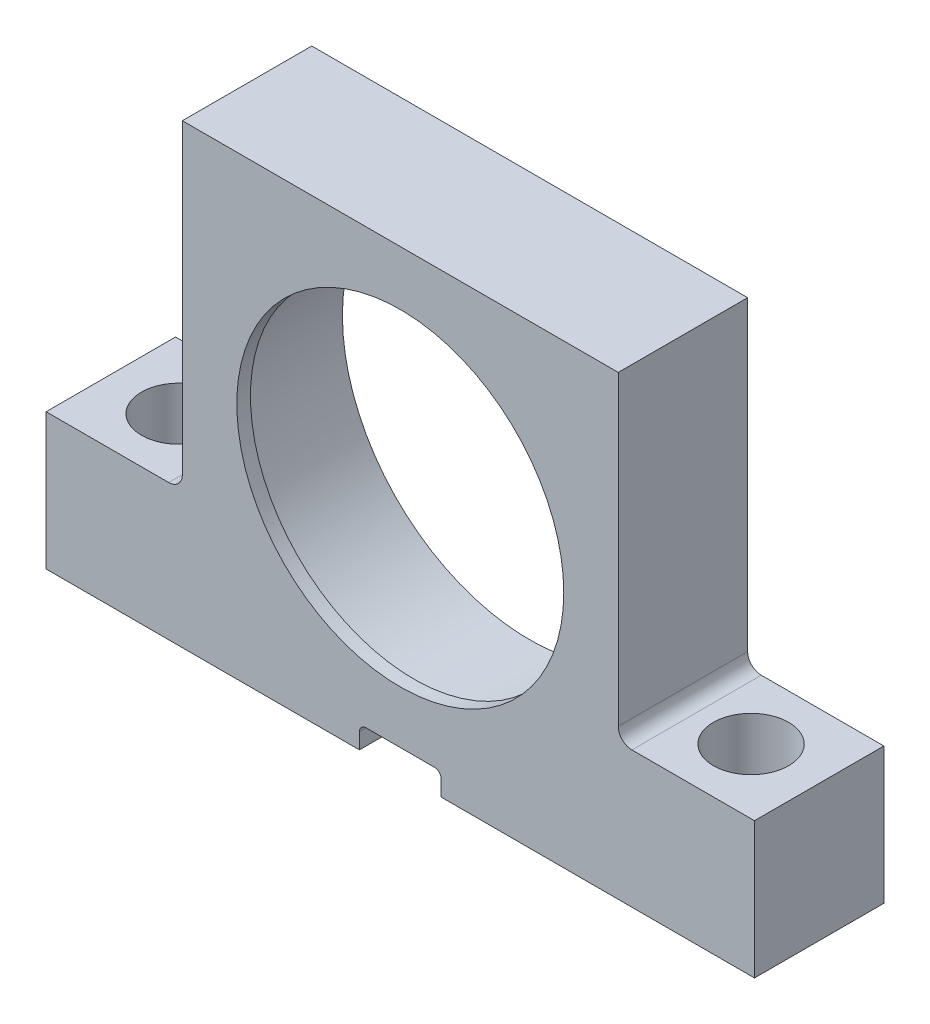
ISO-10303-21;
HEADER;
FILE_DESCRIPTION(('STEP AP214'),'2;1');
FILE_NAME('part.step','',(''),(''),'','','');
FILE_SCHEMA(('AUTOMOTIVE_DESIGN { 1 0 10303 214 1 1 1 1 }'));
ENDSEC;
DATA;
#1=APPLICATION_CONTEXT('core data for automotive mechanical design processes');
#2=APPLICATION_PROTOCOL_DEFINITION('international standard','automotive_design',2000,#1);
#3=PRODUCT_CONTEXT('',#1,'mechanical');
#4=PRODUCT('Part','Part','',(#3));
#5=PRODUCT_RELATED_PRODUCT_CATEGORY('part','',(#4));
#6=PRODUCT_DEFINITION_FORMATION('','',#4);
#7=PRODUCT_DEFINITION_CONTEXT('part definition',#1,'design');
#8=PRODUCT_DEFINITION('design','',#6,#7);
#9=PRODUCT_DEFINITION_SHAPE('','',#8);
#10=(LENGTH_UNIT() NAMED_UNIT(*) SI_UNIT(.MILLI.,.METRE.));
#11=(NAMED_UNIT(*) PLANE_ANGLE_UNIT() SI_UNIT($,.RADIAN.));
#12=(NAMED_UNIT(*) SI_UNIT($,.STERADIAN.) SOLID_ANGLE_UNIT());
#13=UNCERTAINTY_MEASURE_WITH_UNIT(LENGTH_MEASURE(1.E-05),#10,'distance_accuracy_value','');
#14=(GEOMETRIC_REPRESENTATION_CONTEXT(3) GLOBAL_UNCERTAINTY_ASSIGNED_CONTEXT((#13)) GLOBAL_UNIT_ASSIGNED_CONTEXT((#10,
#11,#12)) REPRESENTATION_CONTEXT('',''));
#15=CARTESIAN_POINT('',(0.,0.,0.));
#16=DIRECTION('',(0.,0.,1.));
#17=DIRECTION('',(1.,0.,0.));
#18=AXIS2_PLACEMENT_3D('',#15,#16,#17);
#19=CARTESIAN_POINT('',(-52.,-10.,19.));
#20=DIRECTION('',(0.,1.,0.));
#21=DIRECTION('',(0.,0.,1.));
#22=AXIS2_PLACEMENT_3D('',#19,#20,#21);
#23=PLANE('',#22);
#24=CARTESIAN_POINT('',(-42.,-10.,9.5));
#25=DIRECTION('',(0.,1.,0.));
#26=DIRECTION('',(0.,0.,1.));
#27=AXIS2_PLACEMENT_3D('',#24,#25,#26);
#28=CIRCLE('',#27,5.5);
#29=CARTESIAN_POINT('',(-42.,-10.,15.));
#30=VERTEX_POINT('',#29);
#31=EDGE_CURVE('E221',#30,#30,#28,.T.);
#32=ORIENTED_EDGE('',*,*,#31,.T.);
#33=EDGE_LOOP('',(#32));
#34=FACE_BOUND('',#33,.T.);
#35=DIRECTION('',(1.,0.,0.));
#36=VECTOR('',#35,1.);
#37=CARTESIAN_POINT('',(-52.,-10.,0.));
#38=LINE('',#37,#36);
#39=CARTESIAN_POINT('',(-52.,-10.,0.));
#40=VERTEX_POINT('',#39);
#41=CARTESIAN_POINT('',(-6.,-10.,0.));
#42=VERTEX_POINT('',#41);
#43=EDGE_CURVE('E181',#40,#42,#38,.T.);
#44=ORIENTED_EDGE('',*,*,#43,.T.);
#45=DIRECTION('',(0.,0.,1.));
#46=VECTOR('',#45,1.);
#47=CARTESIAN_POINT('',(-6.,-10.,19.));
#48=LINE('',#47,#46);
#49=CARTESIAN_POINT('',(-6.,-10.,19.));
#50=VERTEX_POINT('',#49);
#51=EDGE_CURVE('E340',#42,#50,#48,.T.);
#52=ORIENTED_EDGE('',*,*,#51,.T.);
#53=DIRECTION('',(1.,0.,0.));
#54=VECTOR('',#53,1.);
#55=CARTESIAN_POINT('',(-52.,-10.,19.));
#56=LINE('',#55,#54);
#57=CARTESIAN_POINT('',(-52.,-10.,19.));
#58=VERTEX_POINT('',#57);
#59=EDGE_CURVE('E196',#58,#50,#56,.T.);
#60=ORIENTED_EDGE('',*,*,#59,.F.);
#61=DIRECTION('',(0.,0.,-1.));
#62=VECTOR('',#61,1.);
#63=CARTESIAN_POINT('',(-52.,-10.,19.));
#64=LINE('',#63,#62);
#65=EDGE_CURVE('E195',#58,#40,#64,.T.);
#66=ORIENTED_EDGE('',*,*,#65,.T.);
#67=EDGE_LOOP('',(#44,#52,#60,#66));
#68=FACE_BOUND('',#67,.T.);
#69=ADVANCED_FACE('F39',(#34,#68),#23,.F.);
#70=CARTESIAN_POINT('',(0.,25.,0.));
#71=DIRECTION('',(0.,0.,1.));
#72=DIRECTION('',(1.,0.,0.));
#73=AXIS2_PLACEMENT_3D('',#70,#71,#72);
#74=CYLINDRICAL_SURFACE('',#73,27.5);
#75=CARTESIAN_POINT('',(0.,25.,0.));
#76=DIRECTION('',(0.,0.,1.));
#77=DIRECTION('',(1.,0.,0.));
#78=AXIS2_PLACEMENT_3D('',#75,#76,#77);
#79=CIRCLE('',#78,27.5);
#80=CARTESIAN_POINT('',(27.5,25.,0.));
#81=VERTEX_POINT('',#80);
#82=EDGE_CURVE('E226',#81,#81,#79,.T.);
#83=ORIENTED_EDGE('',*,*,#82,.F.);
#84=EDGE_LOOP('',(#83));
#85=FACE_BOUND('',#84,.T.);
#86=CARTESIAN_POINT('',(0.,25.,17.));
#87=DIRECTION('',(0.,0.,1.));
#88=DIRECTION('',(1.,0.,0.));
#89=AXIS2_PLACEMENT_3D('',#86,#87,#88);
#90=CIRCLE('',#89,27.5);
#91=CARTESIAN_POINT('',(27.5,25.,17.));
#92=VERTEX_POINT('',#91);
#93=EDGE_CURVE('E216',#92,#92,#90,.F.);
#94=ORIENTED_EDGE('',*,*,#93,.F.);
#95=EDGE_LOOP('',(#94));
#96=FACE_BOUND('',#95,.T.);
#97=ADVANCED_FACE('F369',(#85,#96),#74,.F.);
#98=CARTESIAN_POINT('',(52.,10.,19.));
#99=DIRECTION('',(-1.,0.,0.));
#100=DIRECTION('',(0.,0.,1.));
#101=AXIS2_PLACEMENT_3D('',#98,#99,#100);
#102=PLANE('',#101);
#103=DIRECTION('',(0.,1.,0.));
#104=VECTOR('',#103,1.);
#105=CARTESIAN_POINT('',(52.,10.,0.));
#106=LINE('',#105,#104);
#107=CARTESIAN_POINT('',(52.,-10.,0.));
#108=VERTEX_POINT('',#107);
#109=CARTESIAN_POINT('',(52.,10.,0.));
#110=VERTEX_POINT('',#109);
#111=EDGE_CURVE('E179',#108,#110,#106,.T.);
#112=ORIENTED_EDGE('',*,*,#111,.T.);
#113=DIRECTION('',(0.,0.,-1.));
#114=VECTOR('',#113,1.);
#115=CARTESIAN_POINT('',(52.,10.,19.));
#116=LINE('',#115,#114);
#117=CARTESIAN_POINT('',(52.,10.,19.));
#118=VERTEX_POINT('',#117);
#119=EDGE_CURVE('E212',#118,#110,#116,.T.);
#120=ORIENTED_EDGE('',*,*,#119,.F.);
#121=DIRECTION('',(0.,1.,0.));
#122=VECTOR('',#121,1.);
#123=CARTESIAN_POINT('',(52.,10.,19.));
#124=LINE('',#123,#122);
#125=CARTESIAN_POINT('',(52.,-10.,19.));
#126=VERTEX_POINT('',#125);
#127=EDGE_CURVE('E187',#126,#118,#124,.T.);
#128=ORIENTED_EDGE('',*,*,#127,.F.);
#129=DIRECTION('',(0.,0.,-1.));
#130=VECTOR('',#129,1.);
#131=CARTESIAN_POINT('',(52.,-10.,19.));
#132=LINE('',#131,#130);
#133=EDGE_CURVE('E192',#126,#108,#132,.T.);
#134=ORIENTED_EDGE('',*,*,#133,.T.);
#135=EDGE_LOOP('',(#112,#120,#128,#134));
#136=FACE_BOUND('',#135,.T.);
#137=ADVANCED_FACE('F367',(#136),#102,.F.);
#138=CARTESIAN_POINT('',(32.,10.,19.));
#139=DIRECTION('',(0.,-1.,0.));
#140=DIRECTION('',(0.,0.,-1.));
#141=AXIS2_PLACEMENT_3D('',#138,#139,#140);
#142=PLANE('',#141);
#143=CARTESIAN_POINT('',(42.,10.,9.5));
#144=DIRECTION('',(0.,1.,0.));
#145=DIRECTION('',(0.,0.,1.));
#146=AXIS2_PLACEMENT_3D('',#143,#144,#145);
#147=CIRCLE('',#146,5.52326756388864);
#148=CARTESIAN_POINT('',(42.,10.,15.0232675638886));
#149=VERTEX_POINT('',#148);
#150=EDGE_CURVE('E573',#149,#149,#147,.T.);
#151=ORIENTED_EDGE('',*,*,#150,.F.);
#152=EDGE_LOOP('',(#151));
#153=FACE_BOUND('',#152,.T.);
#154=DIRECTION('',(-1.,0.,0.));
#155=VECTOR('',#154,1.);
#156=CARTESIAN_POINT('',(32.,10.,0.));
#157=LINE('',#156,#155);
#158=CARTESIAN_POINT('',(34.,10.,0.));
#159=VERTEX_POINT('',#158);
#160=EDGE_CURVE('E310',#110,#159,#157,.T.);
#161=ORIENTED_EDGE('',*,*,#160,.T.);
#162=DIRECTION('',(0.,0.,-1.));
#163=VECTOR('',#162,1.);
#164=CARTESIAN_POINT('',(34.,10.,19.));
#165=LINE('',#164,#163);
#166=CARTESIAN_POINT('',(34.,10.,19.));
#167=VERTEX_POINT('',#166);
#168=EDGE_CURVE('E55',#159,#167,#165,.F.);
#169=ORIENTED_EDGE('',*,*,#168,.T.);
#170=DIRECTION('',(-1.,0.,0.));
#171=VECTOR('',#170,1.);
#172=CARTESIAN_POINT('',(32.,10.,19.));
#173=LINE('',#172,#171);
#174=EDGE_CURVE('E296',#118,#167,#173,.T.);
#175=ORIENTED_EDGE('',*,*,#174,.F.);
#176=ORIENTED_EDGE('',*,*,#119,.T.);
#177=EDGE_LOOP('',(#161,#169,#175,#176));
#178=FACE_BOUND('',#177,.T.);
#179=ADVANCED_FACE('F365',(#153,#178),#142,.F.);
#180=CARTESIAN_POINT('',(32.,10.,19.));
#181=DIRECTION('',(-1.,0.,0.));
#182=DIRECTION('',(0.,0.,1.));
#183=AXIS2_PLACEMENT_3D('',#180,#181,#182);
#184=PLANE('',#183);
#185=DIRECTION('',(0.,1.,0.));
#186=VECTOR('',#185,1.);
#187=CARTESIAN_POINT('',(32.,10.,19.));
#188=LINE('',#187,#186);
#189=CARTESIAN_POINT('',(32.,12.,19.));
#190=VERTEX_POINT('',#189);
#191=CARTESIAN_POINT('',(32.,57.,19.));
#192=VERTEX_POINT('',#191);
#193=EDGE_CURVE('E293',#190,#192,#188,.T.);
#194=ORIENTED_EDGE('',*,*,#193,.F.);
#195=DIRECTION('',(0.,0.,-1.));
#196=VECTOR('',#195,1.);
#197=CARTESIAN_POINT('',(32.,12.,0.));
#198=LINE('',#197,#196);
#199=CARTESIAN_POINT('',(32.,12.,0.));
#200=VERTEX_POINT('',#199);
#201=EDGE_CURVE('E264',#190,#200,#198,.T.);
#202=ORIENTED_EDGE('',*,*,#201,.T.);
#203=DIRECTION('',(0.,1.,0.));
#204=VECTOR('',#203,1.);
#205=CARTESIAN_POINT('',(32.,10.,0.));
#206=LINE('',#205,#204);
#207=CARTESIAN_POINT('',(32.,57.,0.));
#208=VERTEX_POINT('',#207);
#209=EDGE_CURVE('E313',#200,#208,#206,.T.);
#210=ORIENTED_EDGE('',*,*,#209,.T.);
#211=DIRECTION('',(0.,0.,-1.));
#212=VECTOR('',#211,1.);
#213=CARTESIAN_POINT('',(32.,57.,19.));
#214=LINE('',#213,#212);
#215=EDGE_CURVE('E208',#192,#208,#214,.T.);
#216=ORIENTED_EDGE('',*,*,#215,.F.);
#217=EDGE_LOOP('',(#194,#202,#210,#216));
#218=FACE_BOUND('',#217,.T.);
#219=ADVANCED_FACE('F361',(#218),#184,.F.);
#220=CARTESIAN_POINT('',(-32.,57.,19.));
#221=DIRECTION('',(0.,-1.,0.));
#222=DIRECTION('',(0.,0.,-1.));
#223=AXIS2_PLACEMENT_3D('',#220,#221,#222);
#224=PLANE('',#223);
#225=DIRECTION('',(-1.,0.,0.));
#226=VECTOR('',#225,1.);
#227=CARTESIAN_POINT('',(-32.,57.,0.));
#228=LINE('',#227,#226);
#229=CARTESIAN_POINT('',(-32.,57.,0.));
#230=VERTEX_POINT('',#229);
#231=EDGE_CURVE('E316',#208,#230,#228,.T.);
#232=ORIENTED_EDGE('',*,*,#231,.T.);
#233=DIRECTION('',(0.,0.,-1.));
#234=VECTOR('',#233,1.);
#235=CARTESIAN_POINT('',(-32.,57.,19.));
#236=LINE('',#235,#234);
#237=CARTESIAN_POINT('',(-32.,57.,19.));
#238=VERTEX_POINT('',#237);
#239=EDGE_CURVE('E204',#238,#230,#236,.T.);
#240=ORIENTED_EDGE('',*,*,#239,.F.);
#241=DIRECTION('',(-1.,0.,0.));
#242=VECTOR('',#241,1.);
#243=CARTESIAN_POINT('',(-32.,57.,19.));
#244=LINE('',#243,#242);
#245=EDGE_CURVE('E290',#192,#238,#244,.T.);
#246=ORIENTED_EDGE('',*,*,#245,.F.);
#247=ORIENTED_EDGE('',*,*,#215,.T.);
#248=EDGE_LOOP('',(#232,#240,#246,#247));
#249=FACE_BOUND('',#248,.T.);
#250=ADVANCED_FACE('F357',(#249),#224,.F.);
#251=CARTESIAN_POINT('',(-32.,10.,19.));
#252=DIRECTION('',(1.,0.,0.));
#253=DIRECTION('',(0.,0.,-1.));
#254=AXIS2_PLACEMENT_3D('',#251,#252,#253);
#255=PLANE('',#254);
#256=DIRECTION('',(0.,-1.,0.));
#257=VECTOR('',#256,1.);
#258=CARTESIAN_POINT('',(-32.,10.,0.));
#259=LINE('',#258,#257);
#260=CARTESIAN_POINT('',(-32.,12.,0.));
#261=VERTEX_POINT('',#260);
#262=EDGE_CURVE('E319',#230,#261,#259,.T.);
#263=ORIENTED_EDGE('',*,*,#262,.T.);
#264=DIRECTION('',(0.,0.,-1.));
#265=VECTOR('',#264,1.);
#266=CARTESIAN_POINT('',(-32.,12.,19.));
#267=LINE('',#266,#265);
#268=CARTESIAN_POINT('',(-32.,12.,19.));
#269=VERTEX_POINT('',#268);
#270=EDGE_CURVE('E261',#261,#269,#267,.F.);
#271=ORIENTED_EDGE('',*,*,#270,.T.);
#272=DIRECTION('',(0.,-1.,0.));
#273=VECTOR('',#272,1.);
#274=CARTESIAN_POINT('',(-32.,10.,19.));
#275=LINE('',#274,#273);
#276=EDGE_CURVE('E286',#238,#269,#275,.T.);
#277=ORIENTED_EDGE('',*,*,#276,.F.);
#278=ORIENTED_EDGE('',*,*,#239,.T.);
#279=EDGE_LOOP('',(#263,#271,#277,#278));
#280=FACE_BOUND('',#279,.T.);
#281=ADVANCED_FACE('F352',(#280),#255,.F.);
#282=CARTESIAN_POINT('',(-52.,10.,19.));
#283=DIRECTION('',(0.,-1.,0.));
#284=DIRECTION('',(0.,0.,-1.));
#285=AXIS2_PLACEMENT_3D('',#282,#283,#284);
#286=PLANE('',#285);
#287=CARTESIAN_POINT('',(-42.,10.,9.5));
#288=DIRECTION('',(0.,1.,0.));
#289=DIRECTION('',(0.,0.,1.));
#290=AXIS2_PLACEMENT_3D('',#287,#288,#289);
#291=CIRCLE('',#290,5.5);
#292=CARTESIAN_POINT('',(-42.,10.,15.));
#293=VERTEX_POINT('',#292);
#294=EDGE_CURVE('E222',#293,#293,#291,.T.);
#295=ORIENTED_EDGE('',*,*,#294,.F.);
#296=EDGE_LOOP('',(#295));
#297=FACE_BOUND('',#296,.T.);
#298=DIRECTION('',(-1.,0.,0.));
#299=VECTOR('',#298,1.);
#300=CARTESIAN_POINT('',(-52.,10.,19.));
#301=LINE('',#300,#299);
#302=CARTESIAN_POINT('',(-34.,10.,19.));
#303=VERTEX_POINT('',#302);
#304=CARTESIAN_POINT('',(-52.,10.,19.));
#305=VERTEX_POINT('',#304);
#306=EDGE_CURVE('E283',#303,#305,#301,.T.);
#307=ORIENTED_EDGE('',*,*,#306,.F.);
#308=DIRECTION('',(0.,0.,-1.));
#309=VECTOR('',#308,1.);
#310=CARTESIAN_POINT('',(-34.,10.,0.));
#311=LINE('',#310,#309);
#312=CARTESIAN_POINT('',(-34.,10.,0.));
#313=VERTEX_POINT('',#312);
#314=EDGE_CURVE('E257',#303,#313,#311,.T.);
#315=ORIENTED_EDGE('',*,*,#314,.T.);
#316=DIRECTION('',(-1.,0.,0.));
#317=VECTOR('',#316,1.);
#318=CARTESIAN_POINT('',(-52.,10.,0.));
#319=LINE('',#318,#317);
#320=CARTESIAN_POINT('',(-52.,10.,0.));
#321=VERTEX_POINT('',#320);
#322=EDGE_CURVE('E188',#313,#321,#319,.T.);
#323=ORIENTED_EDGE('',*,*,#322,.T.);
#324=DIRECTION('',(0.,0.,-1.));
#325=VECTOR('',#324,1.);
#326=CARTESIAN_POINT('',(-52.,10.,19.));
#327=LINE('',#326,#325);
#328=EDGE_CURVE('E200',#305,#321,#327,.T.);
#329=ORIENTED_EDGE('',*,*,#328,.F.);
#330=EDGE_LOOP('',(#307,#315,#323,#329));
#331=FACE_BOUND('',#330,.T.);
#332=ADVANCED_FACE('F327',(#297,#331),#286,.F.);
#333=CARTESIAN_POINT('',(-52.,10.,19.));
#334=DIRECTION('',(1.,0.,0.));
#335=DIRECTION('',(0.,0.,-1.));
#336=AXIS2_PLACEMENT_3D('',#333,#334,#335);
#337=PLANE('',#336);
#338=DIRECTION('',(0.,-1.,0.));
#339=VECTOR('',#338,1.);
#340=CARTESIAN_POINT('',(-52.,10.,0.));
#341=LINE('',#340,#339);
#342=EDGE_CURVE('E182',#321,#40,#341,.T.);
#343=ORIENTED_EDGE('',*,*,#342,.T.);
#344=ORIENTED_EDGE('',*,*,#65,.F.);
#345=DIRECTION('',(0.,-1.,0.));
#346=VECTOR('',#345,1.);
#347=CARTESIAN_POINT('',(-52.,10.,19.));
#348=LINE('',#347,#346);
#349=EDGE_CURVE('E281',#305,#58,#348,.T.);
#350=ORIENTED_EDGE('',*,*,#349,.F.);
#351=ORIENTED_EDGE('',*,*,#328,.T.);
#352=EDGE_LOOP('',(#343,#344,#350,#351));
#353=FACE_BOUND('',#352,.T.);
#354=ADVANCED_FACE('F332',(#353),#337,.F.);
#355=CARTESIAN_POINT('',(42.,-10.,9.5));
#356=DIRECTION('',(0.,1.,0.));
#357=DIRECTION('',(0.,0.,1.));
#358=AXIS2_PLACEMENT_3D('',#355,#356,#357);
#359=CIRCLE('',#358,5.52326756388864);
#360=CARTESIAN_POINT('',(42.,-10.,15.0232675638886));
#361=VERTEX_POINT('',#360);
#362=EDGE_CURVE('E217',#361,#361,#359,.T.);
#363=ORIENTED_EDGE('',*,*,#362,.T.);
#364=EDGE_LOOP('',(#363));
#365=FACE_BOUND('',#364,.T.);
#366=CARTESIAN_POINT('',(6.,-10.,19.));
#367=VERTEX_POINT('',#366);
#368=EDGE_CURVE('E170',#367,#126,#56,.T.);
#369=ORIENTED_EDGE('',*,*,#368,.F.);
#370=DIRECTION('',(0.,0.,-1.));
#371=VECTOR('',#370,1.);
#372=CARTESIAN_POINT('',(6.,-10.,19.));
#373=LINE('',#372,#371);
#374=CARTESIAN_POINT('',(6.,-10.,0.));
#375=VERTEX_POINT('',#374);
#376=EDGE_CURVE('E155',#367,#375,#373,.T.);
#377=ORIENTED_EDGE('',*,*,#376,.T.);
#378=EDGE_CURVE('E168',#375,#108,#38,.T.);
#379=ORIENTED_EDGE('',*,*,#378,.T.);
#380=ORIENTED_EDGE('',*,*,#133,.F.);
#381=EDGE_LOOP('',(#369,#377,#379,#380));
#382=FACE_BOUND('',#381,.T.);
#383=ADVANCED_FACE('F166',(#365,#382),#23,.F.);
#384=CARTESIAN_POINT('',(0.,0.,19.));
#385=DIRECTION('',(0.,0.,1.));
#386=DIRECTION('',(1.,0.,0.));
#387=AXIS2_PLACEMENT_3D('',#384,#385,#386);
#388=PLANE('',#387);
#389=DIRECTION('',(0.,-1.,0.));
#390=VECTOR('',#389,1.);
#391=CARTESIAN_POINT('',(-6.,0.,19.));
#392=LINE('',#391,#390);
#393=CARTESIAN_POINT('',(-6.,-7.70000000000001,19.));
#394=VERTEX_POINT('',#393);
#395=EDGE_CURVE('E172',#394,#50,#392,.T.);
#396=ORIENTED_EDGE('',*,*,#395,.F.);
#397=CARTESIAN_POINT('',(-5.,-7.70000000000001,19.));
#398=DIRECTION('',(0.,0.,1.));
#399=DIRECTION('',(1.,0.,0.));
#400=AXIS2_PLACEMENT_3D('',#397,#398,#399);
#401=CIRCLE('',#400,1.);
#402=CARTESIAN_POINT('',(-5.,-6.70000000000001,19.));
#403=VERTEX_POINT('',#402);
#404=EDGE_CURVE('E254',#394,#403,#401,.F.);
#405=ORIENTED_EDGE('',*,*,#404,.T.);
#406=DIRECTION('',(-1.,0.,0.));
#407=VECTOR('',#406,1.);
#408=CARTESIAN_POINT('',(0.,-6.70000000000001,19.));
#409=LINE('',#408,#407);
#410=CARTESIAN_POINT('',(5.,-6.70000000000001,19.));
#411=VERTEX_POINT('',#410);
#412=EDGE_CURVE('E161',#411,#403,#409,.T.);
#413=ORIENTED_EDGE('',*,*,#412,.F.);
#414=CARTESIAN_POINT('',(5.,-7.70000000000001,19.));
#415=DIRECTION('',(0.,0.,1.));
#416=DIRECTION('',(1.,0.,0.));
#417=AXIS2_PLACEMENT_3D('',#414,#415,#416);
#418=CIRCLE('',#417,1.);
#419=CARTESIAN_POINT('',(6.,-7.70000000000001,19.));
#420=VERTEX_POINT('',#419);
#421=EDGE_CURVE('E248',#411,#420,#418,.F.);
#422=ORIENTED_EDGE('',*,*,#421,.T.);
#423=DIRECTION('',(0.,1.,0.));
#424=VECTOR('',#423,1.);
#425=CARTESIAN_POINT('',(6.,0.,19.));
#426=LINE('',#425,#424);
#427=EDGE_CURVE('E173',#367,#420,#426,.T.);
#428=ORIENTED_EDGE('',*,*,#427,.F.);
#429=ORIENTED_EDGE('',*,*,#368,.T.);
#430=ORIENTED_EDGE('',*,*,#127,.T.);
#431=ORIENTED_EDGE('',*,*,#174,.T.);
#432=CARTESIAN_POINT('',(34.,12.,19.));
#433=DIRECTION('',(0.,0.,1.));
#434=DIRECTION('',(1.,0.,0.));
#435=AXIS2_PLACEMENT_3D('',#432,#433,#434);
#436=CIRCLE('',#435,2.);
#437=EDGE_CURVE('E11',#167,#190,#436,.F.);
#438=ORIENTED_EDGE('',*,*,#437,.T.);
#439=ORIENTED_EDGE('',*,*,#193,.T.);
#440=ORIENTED_EDGE('',*,*,#245,.T.);
#441=ORIENTED_EDGE('',*,*,#276,.T.);
#442=CARTESIAN_POINT('',(-34.,12.,19.));
#443=DIRECTION('',(0.,0.,1.));
#444=DIRECTION('',(1.,0.,0.));
#445=AXIS2_PLACEMENT_3D('',#442,#443,#444);
#446=CIRCLE('',#445,2.);
#447=EDGE_CURVE('E273',#269,#303,#446,.F.);
#448=ORIENTED_EDGE('',*,*,#447,.T.);
#449=ORIENTED_EDGE('',*,*,#306,.T.);
#450=ORIENTED_EDGE('',*,*,#349,.T.);
#451=ORIENTED_EDGE('',*,*,#59,.T.);
#452=EDGE_LOOP('',(#396,#405,#413,#422,#428,#429,#430,#431,#438,#439,#440,#441,#448,#449,#450,#451));
#453=FACE_BOUND('',#452,.T.);
#454=CARTESIAN_POINT('',(0.,25.,19.));
#455=DIRECTION('',(0.,0.,1.));
#456=DIRECTION('',(1.,0.,0.));
#457=AXIS2_PLACEMENT_3D('',#454,#455,#456);
#458=CIRCLE('',#457,24.);
#459=CARTESIAN_POINT('',(24.,25.,19.));
#460=VERTEX_POINT('',#459);
#461=EDGE_CURVE('E578',#460,#460,#458,.T.);
#462=ORIENTED_EDGE('',*,*,#461,.F.);
#463=EDGE_LOOP('',(#462));
#464=FACE_BOUND('',#463,.T.);
#465=ADVANCED_FACE('F342',(#453,#464),#388,.T.);
#466=CARTESIAN_POINT('',(0.,0.,0.));
#467=DIRECTION('',(0.,0.,1.));
#468=DIRECTION('',(1.,0.,0.));
#469=AXIS2_PLACEMENT_3D('',#466,#467,#468);
#470=PLANE('',#469);
#471=ORIENTED_EDGE('',*,*,#82,.T.);
#472=EDGE_LOOP('',(#471));
#473=FACE_BOUND('',#472,.T.);
#474=DIRECTION('',(1.,0.,0.));
#475=VECTOR('',#474,1.);
#476=CARTESIAN_POINT('',(6.,-6.70000000000001,0.));
#477=LINE('',#476,#475);
#478=CARTESIAN_POINT('',(-5.,-6.70000000000001,0.));
#479=VERTEX_POINT('',#478);
#480=CARTESIAN_POINT('',(5.,-6.70000000000001,0.));
#481=VERTEX_POINT('',#480);
#482=EDGE_CURVE('E162',#479,#481,#477,.T.);
#483=ORIENTED_EDGE('',*,*,#482,.F.);
#484=CARTESIAN_POINT('',(-5.,-7.70000000000001,0.));
#485=DIRECTION('',(0.,0.,1.));
#486=DIRECTION('',(1.,0.,0.));
#487=AXIS2_PLACEMENT_3D('',#484,#485,#486);
#488=CIRCLE('',#487,1.);
#489=CARTESIAN_POINT('',(-6.,-7.70000000000001,0.));
#490=VERTEX_POINT('',#489);
#491=EDGE_CURVE('E251',#479,#490,#488,.T.);
#492=ORIENTED_EDGE('',*,*,#491,.T.);
#493=DIRECTION('',(0.,-1.,0.));
#494=VECTOR('',#493,1.);
#495=CARTESIAN_POINT('',(-6.,0.,0.));
#496=LINE('',#495,#494);
#497=EDGE_CURVE('E230',#490,#42,#496,.T.);
#498=ORIENTED_EDGE('',*,*,#497,.T.);
#499=ORIENTED_EDGE('',*,*,#43,.F.);
#500=ORIENTED_EDGE('',*,*,#342,.F.);
#501=ORIENTED_EDGE('',*,*,#322,.F.);
#502=CARTESIAN_POINT('',(-34.,12.,0.));
#503=DIRECTION('',(0.,0.,1.));
#504=DIRECTION('',(1.,0.,0.));
#505=AXIS2_PLACEMENT_3D('',#502,#503,#504);
#506=CIRCLE('',#505,2.);
#507=EDGE_CURVE('E270',#313,#261,#506,.T.);
#508=ORIENTED_EDGE('',*,*,#507,.T.);
#509=ORIENTED_EDGE('',*,*,#262,.F.);
#510=ORIENTED_EDGE('',*,*,#231,.F.);
#511=ORIENTED_EDGE('',*,*,#209,.F.);
#512=CARTESIAN_POINT('',(34.,12.,0.));
#513=DIRECTION('',(0.,0.,1.));
#514=DIRECTION('',(1.,0.,0.));
#515=AXIS2_PLACEMENT_3D('',#512,#513,#514);
#516=CIRCLE('',#515,2.);
#517=EDGE_CURVE('E48',#200,#159,#516,.T.);
#518=ORIENTED_EDGE('',*,*,#517,.T.);
#519=ORIENTED_EDGE('',*,*,#160,.F.);
#520=ORIENTED_EDGE('',*,*,#111,.F.);
#521=ORIENTED_EDGE('',*,*,#378,.F.);
#522=DIRECTION('',(0.,-1.,0.));
#523=VECTOR('',#522,1.);
#524=CARTESIAN_POINT('',(6.,-6.70000000000001,0.));
#525=LINE('',#524,#523);
#526=CARTESIAN_POINT('',(6.,-7.70000000000001,0.));
#527=VERTEX_POINT('',#526);
#528=EDGE_CURVE('E151',#527,#375,#525,.T.);
#529=ORIENTED_EDGE('',*,*,#528,.F.);
#530=CARTESIAN_POINT('',(5.,-7.70000000000001,0.));
#531=DIRECTION('',(0.,0.,1.));
#532=DIRECTION('',(1.,0.,0.));
#533=AXIS2_PLACEMENT_3D('',#530,#531,#532);
#534=CIRCLE('',#533,1.);
#535=EDGE_CURVE('E245',#527,#481,#534,.T.);
#536=ORIENTED_EDGE('',*,*,#535,.T.);
#537=EDGE_LOOP('',(#483,#492,#498,#499,#500,#501,#508,#509,#510,#511,#518,#519,#520,#521,#529,#536));
#538=FACE_BOUND('',#537,.T.);
#539=ADVANCED_FACE('F177',(#473,#538),#470,.F.);
#540=CARTESIAN_POINT('',(42.,-20.,9.5));
#541=DIRECTION('',(0.,1.,0.));
#542=DIRECTION('',(0.,0.,1.));
#543=AXIS2_PLACEMENT_3D('',#540,#541,#542);
#544=CYLINDRICAL_SURFACE('',#543,5.52326756388864);
#545=ORIENTED_EDGE('',*,*,#150,.T.);
#546=EDGE_LOOP('',(#545));
#547=FACE_BOUND('',#546,.T.);
#548=ORIENTED_EDGE('',*,*,#362,.F.);
#549=EDGE_LOOP('',(#548));
#550=FACE_BOUND('',#549,.T.);
#551=ADVANCED_FACE('F396',(#547,#550),#544,.F.);
#552=CARTESIAN_POINT('',(-42.,-20.,9.5));
#553=DIRECTION('',(0.,1.,0.));
#554=DIRECTION('',(0.,0.,1.));
#555=AXIS2_PLACEMENT_3D('',#552,#553,#554);
#556=CYLINDRICAL_SURFACE('',#555,5.5);
#557=ORIENTED_EDGE('',*,*,#294,.T.);
#558=EDGE_LOOP('',(#557));
#559=FACE_BOUND('',#558,.T.);
#560=ORIENTED_EDGE('',*,*,#31,.F.);
#561=EDGE_LOOP('',(#560));
#562=FACE_BOUND('',#561,.T.);
#563=ADVANCED_FACE('F398',(#559,#562),#556,.F.);
#564=CARTESIAN_POINT('',(0.,25.,17.));
#565=DIRECTION('',(0.,0.,1.));
#566=DIRECTION('',(1.,0.,0.));
#567=AXIS2_PLACEMENT_3D('',#564,#565,#566);
#568=PLANE('',#567);
#569=CARTESIAN_POINT('',(0.,25.,17.));
#570=DIRECTION('',(0.,0.,1.));
#571=DIRECTION('',(1.,0.,0.));
#572=AXIS2_PLACEMENT_3D('',#569,#570,#571);
#573=CIRCLE('',#572,24.);
#574=CARTESIAN_POINT('',(24.,25.,17.));
#575=VERTEX_POINT('',#574);
#576=EDGE_CURVE('E576',#575,#575,#573,.T.);
#577=ORIENTED_EDGE('',*,*,#576,.T.);
#578=EDGE_LOOP('',(#577));
#579=FACE_BOUND('',#578,.T.);
#580=ORIENTED_EDGE('',*,*,#93,.T.);
#581=EDGE_LOOP('',(#580));
#582=FACE_BOUND('',#581,.T.);
#583=ADVANCED_FACE('F405',(#579,#582),#568,.F.);
#584=CARTESIAN_POINT('',(0.,25.,17.));
#585=DIRECTION('',(0.,0.,1.));
#586=DIRECTION('',(1.,0.,0.));
#587=AXIS2_PLACEMENT_3D('',#584,#585,#586);
#588=CYLINDRICAL_SURFACE('',#587,24.);
#589=ORIENTED_EDGE('',*,*,#576,.F.);
#590=EDGE_LOOP('',(#589));
#591=FACE_BOUND('',#590,.T.);
#592=ORIENTED_EDGE('',*,*,#461,.T.);
#593=EDGE_LOOP('',(#592));
#594=FACE_BOUND('',#593,.T.);
#595=ADVANCED_FACE('F413',(#591,#594),#588,.F.);
#596=CARTESIAN_POINT('',(-6.,-6.70000000000001,30.));
#597=DIRECTION('',(-1.,0.,0.));
#598=DIRECTION('',(0.,0.,1.));
#599=AXIS2_PLACEMENT_3D('',#596,#597,#598);
#600=PLANE('',#599);
#601=ORIENTED_EDGE('',*,*,#497,.F.);
#602=DIRECTION('',(0.,0.,-1.));
#603=VECTOR('',#602,1.);
#604=CARTESIAN_POINT('',(-6.,-7.70000000000001,19.));
#605=LINE('',#604,#603);
#606=EDGE_CURVE('E242',#490,#394,#605,.F.);
#607=ORIENTED_EDGE('',*,*,#606,.T.);
#608=ORIENTED_EDGE('',*,*,#395,.T.);
#609=ORIENTED_EDGE('',*,*,#51,.F.);
#610=EDGE_LOOP('',(#601,#607,#608,#609));
#611=FACE_BOUND('',#610,.T.);
#612=ADVANCED_FACE('F417',(#611),#600,.F.);
#613=CARTESIAN_POINT('',(6.,-6.70000000000001,30.));
#614=DIRECTION('',(1.,0.,0.));
#615=DIRECTION('',(0.,0.,-1.));
#616=AXIS2_PLACEMENT_3D('',#613,#614,#615);
#617=PLANE('',#616);
#618=ORIENTED_EDGE('',*,*,#427,.T.);
#619=DIRECTION('',(0.,0.,-1.));
#620=VECTOR('',#619,1.);
#621=CARTESIAN_POINT('',(6.,-7.70000000000001,0.));
#622=LINE('',#621,#620);
#623=EDGE_CURVE('E158',#420,#527,#622,.T.);
#624=ORIENTED_EDGE('',*,*,#623,.T.);
#625=ORIENTED_EDGE('',*,*,#528,.T.);
#626=ORIENTED_EDGE('',*,*,#376,.F.);
#627=EDGE_LOOP('',(#618,#624,#625,#626));
#628=FACE_BOUND('',#627,.T.);
#629=ADVANCED_FACE('F154',(#628),#617,.F.);
#630=CARTESIAN_POINT('',(6.,-6.70000000000001,30.));
#631=DIRECTION('',(0.,1.,0.));
#632=DIRECTION('',(0.,0.,1.));
#633=AXIS2_PLACEMENT_3D('',#630,#631,#632);
#634=PLANE('',#633);
#635=ORIENTED_EDGE('',*,*,#482,.T.);
#636=DIRECTION('',(0.,0.,-1.));
#637=VECTOR('',#636,1.);
#638=CARTESIAN_POINT('',(5.,-6.70000000000001,19.));
#639=LINE('',#638,#637);
#640=EDGE_CURVE('E239',#481,#411,#639,.F.);
#641=ORIENTED_EDGE('',*,*,#640,.T.);
#642=ORIENTED_EDGE('',*,*,#412,.T.);
#643=DIRECTION('',(0.,0.,-1.));
#644=VECTOR('',#643,1.);
#645=CARTESIAN_POINT('',(-5.,-6.70000000000001,0.));
#646=LINE('',#645,#644);
#647=EDGE_CURVE('E235',#403,#479,#646,.T.);
#648=ORIENTED_EDGE('',*,*,#647,.T.);
#649=EDGE_LOOP('',(#635,#641,#642,#648));
#650=FACE_BOUND('',#649,.T.);
#651=ADVANCED_FACE('F422',(#650),#634,.F.);
#652=CARTESIAN_POINT('',(5.,-7.70000000000001,30.));
#653=DIRECTION('',(0.,0.,1.));
#654=DIRECTION('',(1.,0.,0.));
#655=AXIS2_PLACEMENT_3D('',#652,#653,#654);
#656=CYLINDRICAL_SURFACE('',#655,1.);
#657=ORIENTED_EDGE('',*,*,#421,.F.);
#658=ORIENTED_EDGE('',*,*,#640,.F.);
#659=ORIENTED_EDGE('',*,*,#535,.F.);
#660=ORIENTED_EDGE('',*,*,#623,.F.);
#661=EDGE_LOOP('',(#657,#658,#659,#660));
#662=FACE_BOUND('',#661,.T.);
#663=ADVANCED_FACE('F425',(#662),#656,.F.);
#664=CARTESIAN_POINT('',(-5.,-7.70000000000001,30.));
#665=DIRECTION('',(0.,0.,1.));
#666=DIRECTION('',(1.,0.,0.));
#667=AXIS2_PLACEMENT_3D('',#664,#665,#666);
#668=CYLINDRICAL_SURFACE('',#667,1.);
#669=ORIENTED_EDGE('',*,*,#404,.F.);
#670=ORIENTED_EDGE('',*,*,#606,.F.);
#671=ORIENTED_EDGE('',*,*,#491,.F.);
#672=ORIENTED_EDGE('',*,*,#647,.F.);
#673=EDGE_LOOP('',(#669,#670,#671,#672));
#674=FACE_BOUND('',#673,.T.);
#675=ADVANCED_FACE('F442',(#674),#668,.F.);
#676=CARTESIAN_POINT('',(-34.,12.,19.));
#677=DIRECTION('',(0.,0.,1.));
#678=DIRECTION('',(1.,0.,0.));
#679=AXIS2_PLACEMENT_3D('',#676,#677,#678);
#680=CYLINDRICAL_SURFACE('',#679,2.);
#681=ORIENTED_EDGE('',*,*,#447,.F.);
#682=ORIENTED_EDGE('',*,*,#270,.F.);
#683=ORIENTED_EDGE('',*,*,#507,.F.);
#684=ORIENTED_EDGE('',*,*,#314,.F.);
#685=EDGE_LOOP('',(#681,#682,#683,#684));
#686=FACE_BOUND('',#685,.T.);
#687=ADVANCED_FACE('F347',(#686),#680,.F.);
#688=CARTESIAN_POINT('',(34.,12.,19.));
#689=DIRECTION('',(0.,0.,1.));
#690=DIRECTION('',(1.,0.,0.));
#691=AXIS2_PLACEMENT_3D('',#688,#689,#690);
#692=CYLINDRICAL_SURFACE('',#691,2.);
#693=ORIENTED_EDGE('',*,*,#437,.F.);
#694=ORIENTED_EDGE('',*,*,#168,.F.);
#695=ORIENTED_EDGE('',*,*,#517,.F.);
#696=ORIENTED_EDGE('',*,*,#201,.F.);
#697=EDGE_LOOP('',(#693,#694,#695,#696));
#698=FACE_BOUND('',#697,.T.);
#699=ADVANCED_FACE('F41',(#698),#692,.F.);
#700=CLOSED_SHELL('',(#69,#97,#137,#179,#219,#250,#281,#332,#354,#383,#465,#539,#551,#563,#583,
#595,#612,#629,#651,#663,#675,#687,#699));
#701=MANIFOLD_SOLID_BREP('B2',#700);
#702=ADVANCED_BREP_SHAPE_REPRESENTATION('',(#18,#701),#14);
#703=SHAPE_DEFINITION_REPRESENTATION(#9,#702);
ENDSEC;
END-ISO-10303-21;
